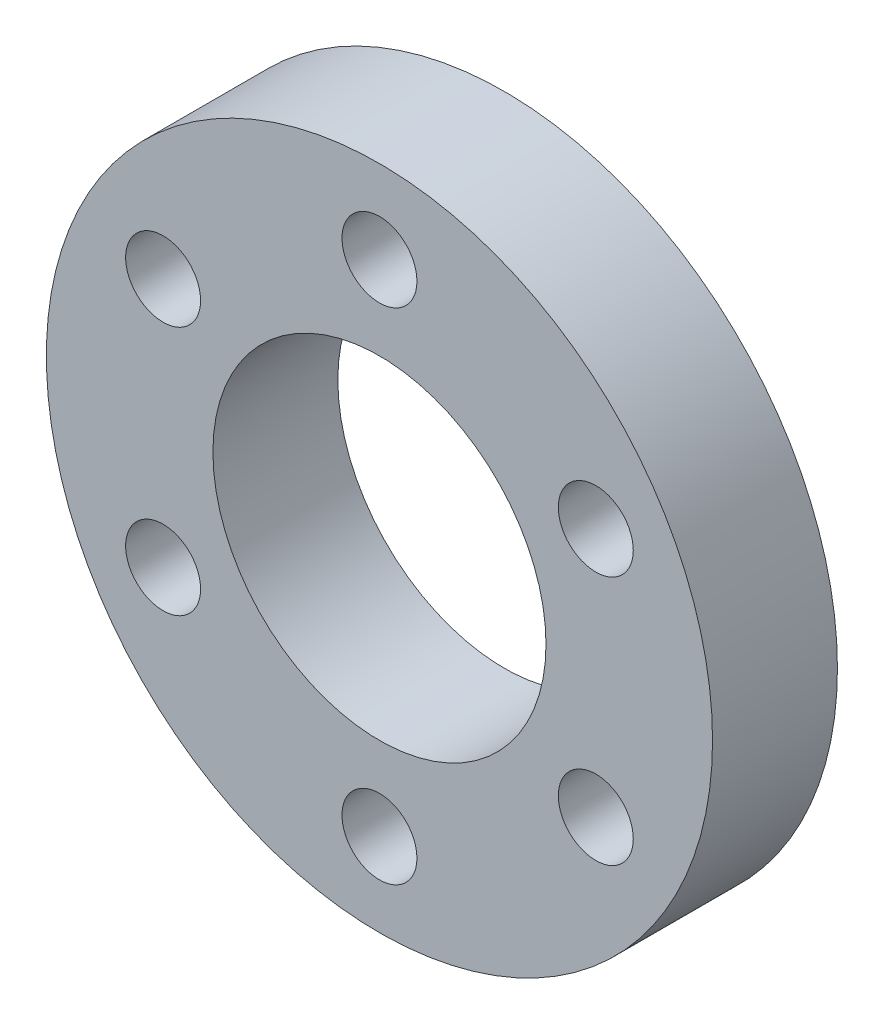
ISO-10303-21;
HEADER;
FILE_DESCRIPTION(('STEP AP214'),'2;1');
FILE_NAME('part.step','',(''),(''),'','','');
FILE_SCHEMA(('AUTOMOTIVE_DESIGN { 1 0 10303 214 1 1 1 1 }'));
ENDSEC;
DATA;
#1=APPLICATION_CONTEXT('core data for automotive mechanical design processes');
#2=APPLICATION_PROTOCOL_DEFINITION('international standard','automotive_design',2000,#1);
#3=PRODUCT_CONTEXT('',#1,'mechanical');
#4=PRODUCT('Part','Part','',(#3));
#5=PRODUCT_RELATED_PRODUCT_CATEGORY('part','',(#4));
#6=PRODUCT_DEFINITION_FORMATION('','',#4);
#7=PRODUCT_DEFINITION_CONTEXT('part definition',#1,'design');
#8=PRODUCT_DEFINITION('design','',#6,#7);
#9=PRODUCT_DEFINITION_SHAPE('','',#8);
#10=(LENGTH_UNIT() NAMED_UNIT(*) SI_UNIT(.MILLI.,.METRE.));
#11=(NAMED_UNIT(*) PLANE_ANGLE_UNIT() SI_UNIT($,.RADIAN.));
#12=(NAMED_UNIT(*) SI_UNIT($,.STERADIAN.) SOLID_ANGLE_UNIT());
#13=UNCERTAINTY_MEASURE_WITH_UNIT(LENGTH_MEASURE(1.E-05),#10,'distance_accuracy_value','');
#14=(GEOMETRIC_REPRESENTATION_CONTEXT(3) GLOBAL_UNCERTAINTY_ASSIGNED_CONTEXT((#13)) GLOBAL_UNIT_ASSIGNED_CONTEXT((#10,
#11,#12)) REPRESENTATION_CONTEXT('',''));
#15=CARTESIAN_POINT('',(0.,0.,0.));
#16=DIRECTION('',(0.,0.,1.));
#17=DIRECTION('',(1.,0.,0.));
#18=AXIS2_PLACEMENT_3D('',#15,#16,#17);
#19=CARTESIAN_POINT('',(0.,0.,3.));
#20=DIRECTION('',(0.,0.,1.));
#21=DIRECTION('',(1.,0.,0.));
#22=AXIS2_PLACEMENT_3D('',#19,#20,#21);
#23=PLANE('',#22);
#24=CARTESIAN_POINT('',(5.1961524227066,3.00000000000006,3.));
#25=DIRECTION('',(0.,0.,1.));
#26=DIRECTION('',(1.,0.,0.));
#27=AXIS2_PLACEMENT_3D('',#24,#25,#26);
#28=CIRCLE('',#27,0.9);
#29=CARTESIAN_POINT('',(6.0961524227066,3.00000000000006,3.));
#30=VERTEX_POINT('',#29);
#31=EDGE_CURVE('E103',#30,#30,#28,.T.);
#32=ORIENTED_EDGE('',*,*,#31,.F.);
#33=EDGE_LOOP('',(#32));
#34=FACE_BOUND('',#33,.T.);
#35=CARTESIAN_POINT('',(5.19615242270666,-2.99999999999995,3.));
#36=DIRECTION('',(0.,0.,1.));
#37=DIRECTION('',(1.,0.,0.));
#38=AXIS2_PLACEMENT_3D('',#35,#36,#37);
#39=CIRCLE('',#38,0.9);
#40=CARTESIAN_POINT('',(6.09615242270666,-2.99999999999995,3.));
#41=VERTEX_POINT('',#40);
#42=EDGE_CURVE('E95',#41,#41,#39,.T.);
#43=ORIENTED_EDGE('',*,*,#42,.F.);
#44=EDGE_LOOP('',(#43));
#45=FACE_BOUND('',#44,.T.);
#46=CARTESIAN_POINT('',(0.,-6.,3.));
#47=DIRECTION('',(0.,0.,1.));
#48=DIRECTION('',(1.,0.,0.));
#49=AXIS2_PLACEMENT_3D('',#46,#47,#48);
#50=CIRCLE('',#49,0.9);
#51=CARTESIAN_POINT('',(0.9,-6.,3.));
#52=VERTEX_POINT('',#51);
#53=EDGE_CURVE('E87',#52,#52,#50,.T.);
#54=ORIENTED_EDGE('',*,*,#53,.F.);
#55=EDGE_LOOP('',(#54));
#56=FACE_BOUND('',#55,.T.);
#57=CARTESIAN_POINT('',(-5.19615242270662,-3.00000000000003,3.));
#58=DIRECTION('',(0.,0.,1.));
#59=DIRECTION('',(1.,0.,0.));
#60=AXIS2_PLACEMENT_3D('',#57,#58,#59);
#61=CIRCLE('',#60,0.9);
#62=CARTESIAN_POINT('',(-4.29615242270662,-3.00000000000003,3.));
#63=VERTEX_POINT('',#62);
#64=EDGE_CURVE('E79',#63,#63,#61,.T.);
#65=ORIENTED_EDGE('',*,*,#64,.F.);
#66=EDGE_LOOP('',(#65));
#67=FACE_BOUND('',#66,.T.);
#68=CARTESIAN_POINT('',(-5.19615242270664,2.99999999999999,3.));
#69=DIRECTION('',(0.,0.,1.));
#70=DIRECTION('',(1.,0.,0.));
#71=AXIS2_PLACEMENT_3D('',#68,#69,#70);
#72=CIRCLE('',#71,0.9);
#73=CARTESIAN_POINT('',(-4.29615242270664,2.99999999999999,3.));
#74=VERTEX_POINT('',#73);
#75=EDGE_CURVE('E71',#74,#74,#72,.T.);
#76=ORIENTED_EDGE('',*,*,#75,.F.);
#77=EDGE_LOOP('',(#76));
#78=FACE_BOUND('',#77,.T.);
#79=CARTESIAN_POINT('',(0.,6.,3.));
#80=DIRECTION('',(0.,0.,1.));
#81=DIRECTION('',(1.,0.,0.));
#82=AXIS2_PLACEMENT_3D('',#79,#80,#81);
#83=CIRCLE('',#82,0.9);
#84=CARTESIAN_POINT('',(0.9,6.,3.));
#85=VERTEX_POINT('',#84);
#86=EDGE_CURVE('E63',#85,#85,#83,.T.);
#87=ORIENTED_EDGE('',*,*,#86,.F.);
#88=EDGE_LOOP('',(#87));
#89=FACE_BOUND('',#88,.T.);
#90=CARTESIAN_POINT('',(0.,0.,3.));
#91=DIRECTION('',(0.,0.,1.));
#92=DIRECTION('',(1.,0.,0.));
#93=AXIS2_PLACEMENT_3D('',#90,#91,#92);
#94=CIRCLE('',#93,8.);
#95=CARTESIAN_POINT('',(8.,0.,3.));
#96=VERTEX_POINT('',#95);
#97=EDGE_CURVE('E10',#96,#96,#94,.T.);
#98=ORIENTED_EDGE('',*,*,#97,.T.);
#99=EDGE_LOOP('',(#98));
#100=FACE_BOUND('',#99,.T.);
#101=CARTESIAN_POINT('',(0.,0.,3.));
#102=DIRECTION('',(0.,0.,1.));
#103=DIRECTION('',(1.,0.,0.));
#104=AXIS2_PLACEMENT_3D('',#101,#102,#103);
#105=CIRCLE('',#104,4.);
#106=CARTESIAN_POINT('',(4.,0.,3.));
#107=VERTEX_POINT('',#106);
#108=EDGE_CURVE('E50',#107,#107,#105,.T.);
#109=ORIENTED_EDGE('',*,*,#108,.F.);
#110=EDGE_LOOP('',(#109));
#111=FACE_BOUND('',#110,.T.);
#112=ADVANCED_FACE('F37',(#34,#45,#56,#67,#78,#89,#100,#111),#23,.T.);
#113=CARTESIAN_POINT('',(0.,0.,0.));
#114=DIRECTION('',(0.,0.,1.));
#115=DIRECTION('',(1.,0.,0.));
#116=AXIS2_PLACEMENT_3D('',#113,#114,#115);
#117=PLANE('',#116);
#118=CARTESIAN_POINT('',(5.1961524227066,3.00000000000006,0.));
#119=DIRECTION('',(0.,0.,1.));
#120=DIRECTION('',(1.,0.,0.));
#121=AXIS2_PLACEMENT_3D('',#118,#119,#120);
#122=CIRCLE('',#121,0.899999999999999);
#123=CARTESIAN_POINT('',(6.0961524227066,3.00000000000006,0.));
#124=VERTEX_POINT('',#123);
#125=EDGE_CURVE('E99',#124,#124,#122,.T.);
#126=ORIENTED_EDGE('',*,*,#125,.T.);
#127=EDGE_LOOP('',(#126));
#128=FACE_BOUND('',#127,.T.);
#129=CARTESIAN_POINT('',(5.19615242270666,-2.99999999999995,0.));
#130=DIRECTION('',(0.,0.,1.));
#131=DIRECTION('',(1.,0.,0.));
#132=AXIS2_PLACEMENT_3D('',#129,#130,#131);
#133=CIRCLE('',#132,0.899999999999999);
#134=CARTESIAN_POINT('',(6.09615242270666,-2.99999999999995,0.));
#135=VERTEX_POINT('',#134);
#136=EDGE_CURVE('E91',#135,#135,#133,.T.);
#137=ORIENTED_EDGE('',*,*,#136,.T.);
#138=EDGE_LOOP('',(#137));
#139=FACE_BOUND('',#138,.T.);
#140=CARTESIAN_POINT('',(0.,-6.,0.));
#141=DIRECTION('',(0.,0.,1.));
#142=DIRECTION('',(1.,0.,0.));
#143=AXIS2_PLACEMENT_3D('',#140,#141,#142);
#144=CIRCLE('',#143,0.899999999999999);
#145=CARTESIAN_POINT('',(0.899999999999999,-6.,0.));
#146=VERTEX_POINT('',#145);
#147=EDGE_CURVE('E83',#146,#146,#144,.T.);
#148=ORIENTED_EDGE('',*,*,#147,.T.);
#149=EDGE_LOOP('',(#148));
#150=FACE_BOUND('',#149,.T.);
#151=CARTESIAN_POINT('',(-5.19615242270662,-3.00000000000003,0.));
#152=DIRECTION('',(0.,0.,1.));
#153=DIRECTION('',(1.,0.,0.));
#154=AXIS2_PLACEMENT_3D('',#151,#152,#153);
#155=CIRCLE('',#154,0.899999999999999);
#156=CARTESIAN_POINT('',(-4.29615242270662,-3.00000000000003,0.));
#157=VERTEX_POINT('',#156);
#158=EDGE_CURVE('E75',#157,#157,#155,.T.);
#159=ORIENTED_EDGE('',*,*,#158,.T.);
#160=EDGE_LOOP('',(#159));
#161=FACE_BOUND('',#160,.T.);
#162=CARTESIAN_POINT('',(-5.19615242270664,2.99999999999999,0.));
#163=DIRECTION('',(0.,0.,1.));
#164=DIRECTION('',(1.,0.,0.));
#165=AXIS2_PLACEMENT_3D('',#162,#163,#164);
#166=CIRCLE('',#165,0.899999999999999);
#167=CARTESIAN_POINT('',(-4.29615242270664,2.99999999999999,0.));
#168=VERTEX_POINT('',#167);
#169=EDGE_CURVE('E67',#168,#168,#166,.T.);
#170=ORIENTED_EDGE('',*,*,#169,.T.);
#171=EDGE_LOOP('',(#170));
#172=FACE_BOUND('',#171,.T.);
#173=CARTESIAN_POINT('',(0.,6.,0.));
#174=DIRECTION('',(0.,0.,1.));
#175=DIRECTION('',(1.,0.,0.));
#176=AXIS2_PLACEMENT_3D('',#173,#174,#175);
#177=CIRCLE('',#176,0.899999999999999);
#178=CARTESIAN_POINT('',(0.899999999999999,6.,0.));
#179=VERTEX_POINT('',#178);
#180=EDGE_CURVE('E56',#179,#179,#177,.T.);
#181=ORIENTED_EDGE('',*,*,#180,.T.);
#182=EDGE_LOOP('',(#181));
#183=FACE_BOUND('',#182,.T.);
#184=CARTESIAN_POINT('',(0.,0.,0.));
#185=DIRECTION('',(0.,0.,1.));
#186=DIRECTION('',(1.,0.,0.));
#187=AXIS2_PLACEMENT_3D('',#184,#185,#186);
#188=CIRCLE('',#187,8.);
#189=CARTESIAN_POINT('',(8.,0.,0.));
#190=VERTEX_POINT('',#189);
#191=EDGE_CURVE('E41',#190,#190,#188,.T.);
#192=ORIENTED_EDGE('',*,*,#191,.F.);
#193=EDGE_LOOP('',(#192));
#194=FACE_BOUND('',#193,.T.);
#195=CARTESIAN_POINT('',(0.,0.,0.));
#196=DIRECTION('',(0.,0.,1.));
#197=DIRECTION('',(1.,0.,0.));
#198=AXIS2_PLACEMENT_3D('',#195,#196,#197);
#199=CIRCLE('',#198,4.);
#200=CARTESIAN_POINT('',(4.,0.,0.));
#201=VERTEX_POINT('',#200);
#202=EDGE_CURVE('E52',#201,#201,#199,.T.);
#203=ORIENTED_EDGE('',*,*,#202,.T.);
#204=EDGE_LOOP('',(#203));
#205=FACE_BOUND('',#204,.T.);
#206=ADVANCED_FACE('F112',(#128,#139,#150,#161,#172,#183,#194,#205),#117,.F.);
#207=CARTESIAN_POINT('',(0.,0.,3.));
#208=DIRECTION('',(0.,0.,-1.));
#209=DIRECTION('',(-1.,0.,0.));
#210=AXIS2_PLACEMENT_3D('',#207,#208,#209);
#211=CYLINDRICAL_SURFACE('',#210,8.);
#212=ORIENTED_EDGE('',*,*,#97,.F.);
#213=EDGE_LOOP('',(#212));
#214=FACE_BOUND('',#213,.T.);
#215=ORIENTED_EDGE('',*,*,#191,.T.);
#216=EDGE_LOOP('',(#215));
#217=FACE_BOUND('',#216,.T.);
#218=ADVANCED_FACE('F39',(#214,#217),#211,.T.);
#219=CARTESIAN_POINT('',(0.,0.,3.));
#220=DIRECTION('',(0.,0.,-1.));
#221=DIRECTION('',(-1.,0.,0.));
#222=AXIS2_PLACEMENT_3D('',#219,#220,#221);
#223=CYLINDRICAL_SURFACE('',#222,4.);
#224=ORIENTED_EDGE('',*,*,#108,.T.);
#225=EDGE_LOOP('',(#224));
#226=FACE_BOUND('',#225,.T.);
#227=ORIENTED_EDGE('',*,*,#202,.F.);
#228=EDGE_LOOP('',(#227));
#229=FACE_BOUND('',#228,.T.);
#230=ADVANCED_FACE('F126',(#226,#229),#223,.F.);
#231=CARTESIAN_POINT('',(0.,6.,3.));
#232=DIRECTION('',(0.,0.,1.));
#233=DIRECTION('',(1.,0.,0.));
#234=AXIS2_PLACEMENT_3D('',#231,#232,#233);
#235=CYLINDRICAL_SURFACE('',#234,0.899999999999999);
#236=ORIENTED_EDGE('',*,*,#180,.F.);
#237=EDGE_LOOP('',(#236));
#238=FACE_BOUND('',#237,.T.);
#239=ORIENTED_EDGE('',*,*,#86,.T.);
#240=EDGE_LOOP('',(#239));
#241=FACE_BOUND('',#240,.T.);
#242=ADVANCED_FACE('F129',(#238,#241),#235,.F.);
#243=CARTESIAN_POINT('',(-5.19615242270664,2.99999999999999,3.));
#244=DIRECTION('',(0.,0.,1.));
#245=DIRECTION('',(1.,0.,0.));
#246=AXIS2_PLACEMENT_3D('',#243,#244,#245);
#247=CYLINDRICAL_SURFACE('',#246,0.899999999999999);
#248=ORIENTED_EDGE('',*,*,#169,.F.);
#249=EDGE_LOOP('',(#248));
#250=FACE_BOUND('',#249,.T.);
#251=ORIENTED_EDGE('',*,*,#75,.T.);
#252=EDGE_LOOP('',(#251));
#253=FACE_BOUND('',#252,.T.);
#254=ADVANCED_FACE('F143',(#250,#253),#247,.F.);
#255=CARTESIAN_POINT('',(-5.19615242270662,-3.00000000000003,3.));
#256=DIRECTION('',(0.,0.,1.));
#257=DIRECTION('',(1.,0.,0.));
#258=AXIS2_PLACEMENT_3D('',#255,#256,#257);
#259=CYLINDRICAL_SURFACE('',#258,0.899999999999999);
#260=ORIENTED_EDGE('',*,*,#158,.F.);
#261=EDGE_LOOP('',(#260));
#262=FACE_BOUND('',#261,.T.);
#263=ORIENTED_EDGE('',*,*,#64,.T.);
#264=EDGE_LOOP('',(#263));
#265=FACE_BOUND('',#264,.T.);
#266=ADVANCED_FACE('F147',(#262,#265),#259,.F.);
#267=CARTESIAN_POINT('',(0.,-6.,3.));
#268=DIRECTION('',(0.,0.,1.));
#269=DIRECTION('',(1.,0.,0.));
#270=AXIS2_PLACEMENT_3D('',#267,#268,#269);
#271=CYLINDRICAL_SURFACE('',#270,0.899999999999999);
#272=ORIENTED_EDGE('',*,*,#147,.F.);
#273=EDGE_LOOP('',(#272));
#274=FACE_BOUND('',#273,.T.);
#275=ORIENTED_EDGE('',*,*,#53,.T.);
#276=EDGE_LOOP('',(#275));
#277=FACE_BOUND('',#276,.T.);
#278=ADVANCED_FACE('F151',(#274,#277),#271,.F.);
#279=CARTESIAN_POINT('',(5.19615242270666,-2.99999999999995,3.));
#280=DIRECTION('',(0.,0.,1.));
#281=DIRECTION('',(1.,0.,0.));
#282=AXIS2_PLACEMENT_3D('',#279,#280,#281);
#283=CYLINDRICAL_SURFACE('',#282,0.899999999999999);
#284=ORIENTED_EDGE('',*,*,#136,.F.);
#285=EDGE_LOOP('',(#284));
#286=FACE_BOUND('',#285,.T.);
#287=ORIENTED_EDGE('',*,*,#42,.T.);
#288=EDGE_LOOP('',(#287));
#289=FACE_BOUND('',#288,.T.);
#290=ADVANCED_FACE('F155',(#286,#289),#283,.F.);
#291=CARTESIAN_POINT('',(5.1961524227066,3.00000000000006,3.));
#292=DIRECTION('',(0.,0.,1.));
#293=DIRECTION('',(1.,0.,0.));
#294=AXIS2_PLACEMENT_3D('',#291,#292,#293);
#295=CYLINDRICAL_SURFACE('',#294,0.899999999999999);
#296=ORIENTED_EDGE('',*,*,#125,.F.);
#297=EDGE_LOOP('',(#296));
#298=FACE_BOUND('',#297,.T.);
#299=ORIENTED_EDGE('',*,*,#31,.T.);
#300=EDGE_LOOP('',(#299));
#301=FACE_BOUND('',#300,.T.);
#302=ADVANCED_FACE('F108',(#298,#301),#295,.F.);
#303=CLOSED_SHELL('',(#112,#206,#218,#230,#242,#254,#266,#278,#290,#302));
#304=MANIFOLD_SOLID_BREP('B2',#303);
#305=ADVANCED_BREP_SHAPE_REPRESENTATION('',(#18,#304),#14);
#306=SHAPE_DEFINITION_REPRESENTATION(#9,#305);
ENDSEC;
END-ISO-10303-21;
